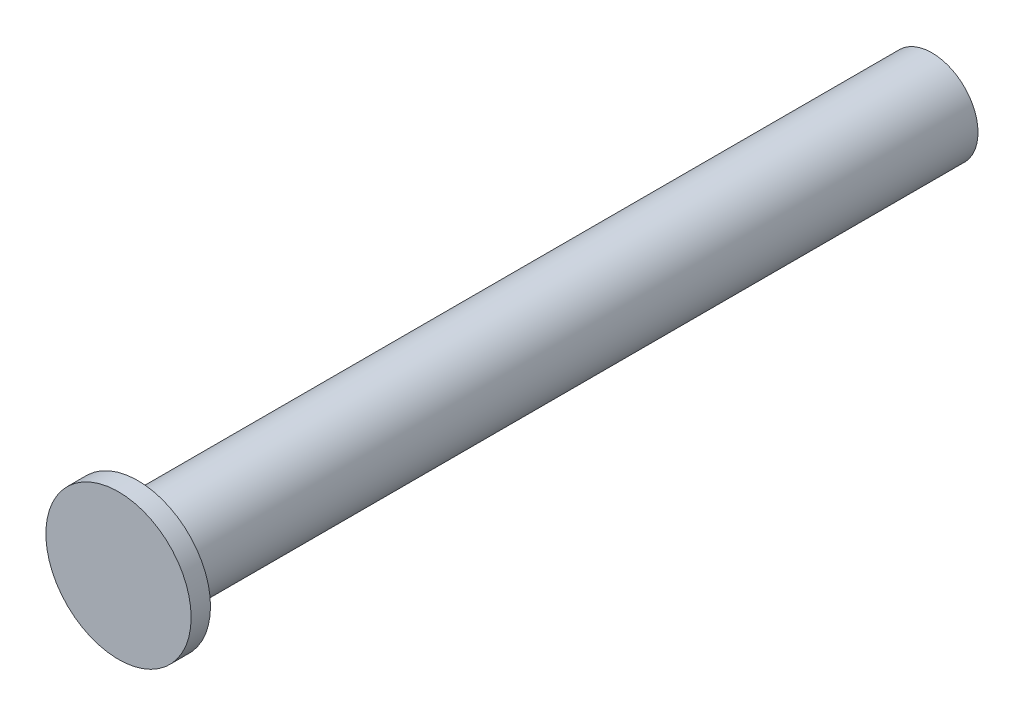
ISO-10303-21;
HEADER;
FILE_DESCRIPTION(('STEP AP214'),'2;1');
FILE_NAME('part.step','',(''),(''),'','','');
FILE_SCHEMA(('AUTOMOTIVE_DESIGN { 1 0 10303 214 1 1 1 1 }'));
ENDSEC;
DATA;
#1=APPLICATION_CONTEXT('core data for automotive mechanical design processes');
#2=APPLICATION_PROTOCOL_DEFINITION('international standard','automotive_design',2000,#1);
#3=PRODUCT_CONTEXT('',#1,'mechanical');
#4=PRODUCT('Part','Part','',(#3));
#5=PRODUCT_RELATED_PRODUCT_CATEGORY('part','',(#4));
#6=PRODUCT_DEFINITION_FORMATION('','',#4);
#7=PRODUCT_DEFINITION_CONTEXT('part definition',#1,'design');
#8=PRODUCT_DEFINITION('design','',#6,#7);
#9=PRODUCT_DEFINITION_SHAPE('','',#8);
#10=(LENGTH_UNIT() NAMED_UNIT(*) SI_UNIT(.MILLI.,.METRE.));
#11=(NAMED_UNIT(*) PLANE_ANGLE_UNIT() SI_UNIT($,.RADIAN.));
#12=(NAMED_UNIT(*) SI_UNIT($,.STERADIAN.) SOLID_ANGLE_UNIT());
#13=UNCERTAINTY_MEASURE_WITH_UNIT(LENGTH_MEASURE(1.E-05),#10,'distance_accuracy_value','');
#14=(GEOMETRIC_REPRESENTATION_CONTEXT(3) GLOBAL_UNCERTAINTY_ASSIGNED_CONTEXT((#13)) GLOBAL_UNIT_ASSIGNED_CONTEXT((#10,
#11,#12)) REPRESENTATION_CONTEXT('',''));
#15=CARTESIAN_POINT('',(0.,0.,0.));
#16=DIRECTION('',(0.,0.,1.));
#17=DIRECTION('',(1.,0.,0.));
#18=AXIS2_PLACEMENT_3D('',#15,#16,#17);
#19=CARTESIAN_POINT('',(0.,0.,82.));
#20=DIRECTION('',(0.,0.,-1.));
#21=DIRECTION('',(-1.,0.,0.));
#22=AXIS2_PLACEMENT_3D('',#19,#20,#21);
#23=CYLINDRICAL_SURFACE('',#22,4.75);
#24=CARTESIAN_POINT('',(0.,0.,82.));
#25=DIRECTION('',(0.,0.,1.));
#26=DIRECTION('',(1.,0.,0.));
#27=AXIS2_PLACEMENT_3D('',#24,#25,#26);
#28=CIRCLE('',#27,4.75);
#29=CARTESIAN_POINT('',(4.75,0.,82.));
#30=VERTEX_POINT('',#29);
#31=EDGE_CURVE('E10',#30,#30,#28,.T.);
#32=ORIENTED_EDGE('',*,*,#31,.F.);
#33=EDGE_LOOP('',(#32));
#34=FACE_BOUND('',#33,.T.);
#35=CARTESIAN_POINT('',(0.,0.,0.));
#36=DIRECTION('',(0.,0.,1.));
#37=DIRECTION('',(1.,0.,0.));
#38=AXIS2_PLACEMENT_3D('',#35,#36,#37);
#39=CIRCLE('',#38,4.75);
#40=CARTESIAN_POINT('',(4.75,0.,0.));
#41=VERTEX_POINT('',#40);
#42=EDGE_CURVE('E42',#41,#41,#39,.T.);
#43=ORIENTED_EDGE('',*,*,#42,.T.);
#44=EDGE_LOOP('',(#43));
#45=FACE_BOUND('',#44,.T.);
#46=ADVANCED_FACE('F39',(#34,#45),#23,.T.);
#47=CARTESIAN_POINT('',(0.,0.,0.));
#48=DIRECTION('',(0.,0.,1.));
#49=DIRECTION('',(1.,0.,0.));
#50=AXIS2_PLACEMENT_3D('',#47,#48,#49);
#51=PLANE('',#50);
#52=ORIENTED_EDGE('',*,*,#42,.F.);
#53=EDGE_LOOP('',(#52));
#54=FACE_BOUND('',#53,.T.);
#55=ADVANCED_FACE('F66',(#54),#51,.F.);
#56=CARTESIAN_POINT('',(0.,0.,84.));
#57=DIRECTION('',(0.,0.,-1.));
#58=DIRECTION('',(-1.,0.,0.));
#59=AXIS2_PLACEMENT_3D('',#56,#57,#58);
#60=CYLINDRICAL_SURFACE('',#59,7.5);
#61=CARTESIAN_POINT('',(0.,0.,84.));
#62=DIRECTION('',(0.,0.,1.));
#63=DIRECTION('',(1.,0.,0.));
#64=AXIS2_PLACEMENT_3D('',#61,#62,#63);
#65=CIRCLE('',#64,7.5);
#66=CARTESIAN_POINT('',(7.5,0.,84.));
#67=VERTEX_POINT('',#66);
#68=EDGE_CURVE('E52',#67,#67,#65,.T.);
#69=ORIENTED_EDGE('',*,*,#68,.F.);
#70=EDGE_LOOP('',(#69));
#71=FACE_BOUND('',#70,.T.);
#72=CARTESIAN_POINT('',(0.,0.,82.));
#73=DIRECTION('',(0.,0.,1.));
#74=DIRECTION('',(1.,0.,0.));
#75=AXIS2_PLACEMENT_3D('',#72,#73,#74);
#76=CIRCLE('',#75,7.5);
#77=CARTESIAN_POINT('',(7.5,0.,82.));
#78=VERTEX_POINT('',#77);
#79=EDGE_CURVE('E54',#78,#78,#76,.T.);
#80=ORIENTED_EDGE('',*,*,#79,.T.);
#81=EDGE_LOOP('',(#80));
#82=FACE_BOUND('',#81,.T.);
#83=ADVANCED_FACE('F63',(#71,#82),#60,.T.);
#84=CARTESIAN_POINT('',(0.,0.,84.));
#85=DIRECTION('',(0.,0.,1.));
#86=DIRECTION('',(1.,0.,0.));
#87=AXIS2_PLACEMENT_3D('',#84,#85,#86);
#88=PLANE('',#87);
#89=ORIENTED_EDGE('',*,*,#68,.T.);
#90=EDGE_LOOP('',(#89));
#91=FACE_BOUND('',#90,.T.);
#92=ADVANCED_FACE('F61',(#91),#88,.T.);
#93=CARTESIAN_POINT('',(0.,0.,82.));
#94=DIRECTION('',(0.,0.,1.));
#95=DIRECTION('',(1.,0.,0.));
#96=AXIS2_PLACEMENT_3D('',#93,#94,#95);
#97=PLANE('',#96);
#98=ORIENTED_EDGE('',*,*,#31,.T.);
#99=EDGE_LOOP('',(#98));
#100=FACE_BOUND('',#99,.T.);
#101=ORIENTED_EDGE('',*,*,#79,.F.);
#102=EDGE_LOOP('',(#101));
#103=FACE_BOUND('',#102,.T.);
#104=ADVANCED_FACE('F70',(#100,#103),#97,.F.);
#105=CLOSED_SHELL('',(#46,#55,#83,#92,#104));
#106=MANIFOLD_SOLID_BREP('B2',#105);
#107=ADVANCED_BREP_SHAPE_REPRESENTATION('',(#18,#106),#14);
#108=SHAPE_DEFINITION_REPRESENTATION(#9,#107);
ENDSEC;
END-ISO-10303-21;
